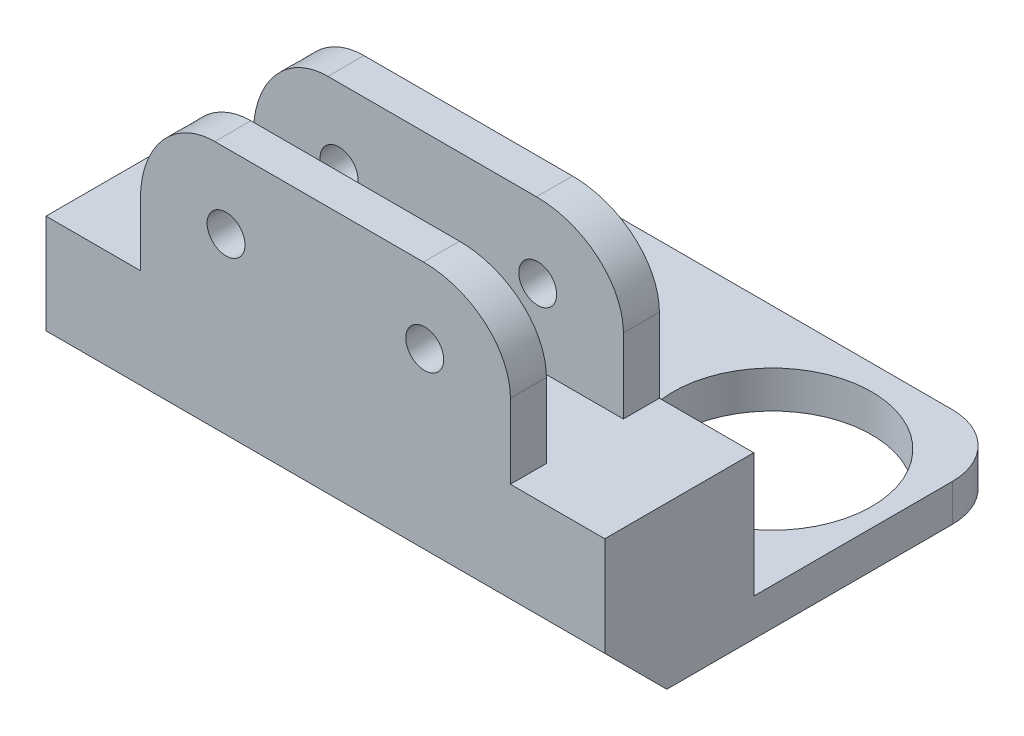
ISO-10303-21;
HEADER;
FILE_DESCRIPTION(('STEP AP214'),'2;1');
FILE_NAME('part.step','',(''),(''),'','','');
FILE_SCHEMA(('AUTOMOTIVE_DESIGN { 1 0 10303 214 1 1 1 1 }'));
ENDSEC;
DATA;
#1=APPLICATION_CONTEXT('core data for automotive mechanical design processes');
#2=APPLICATION_PROTOCOL_DEFINITION('international standard','automotive_design',2000,#1);
#3=PRODUCT_CONTEXT('',#1,'mechanical');
#4=PRODUCT('Part','Part','',(#3));
#5=PRODUCT_RELATED_PRODUCT_CATEGORY('part','',(#4));
#6=PRODUCT_DEFINITION_FORMATION('','',#4);
#7=PRODUCT_DEFINITION_CONTEXT('part definition',#1,'design');
#8=PRODUCT_DEFINITION('design','',#6,#7);
#9=PRODUCT_DEFINITION_SHAPE('','',#8);
#10=(LENGTH_UNIT() NAMED_UNIT(*) SI_UNIT(.MILLI.,.METRE.));
#11=(NAMED_UNIT(*) PLANE_ANGLE_UNIT() SI_UNIT($,.RADIAN.));
#12=(NAMED_UNIT(*) SI_UNIT($,.STERADIAN.) SOLID_ANGLE_UNIT());
#13=UNCERTAINTY_MEASURE_WITH_UNIT(LENGTH_MEASURE(1.E-05),#10,'distance_accuracy_value','');
#14=(GEOMETRIC_REPRESENTATION_CONTEXT(3) GLOBAL_UNCERTAINTY_ASSIGNED_CONTEXT((#13)) GLOBAL_UNIT_ASSIGNED_CONTEXT((#10,
#11,#12)) REPRESENTATION_CONTEXT('',''));
#15=CARTESIAN_POINT('',(0.,0.,0.));
#16=DIRECTION('',(0.,0.,1.));
#17=DIRECTION('',(1.,0.,0.));
#18=AXIS2_PLACEMENT_3D('',#15,#16,#17);
#19=CARTESIAN_POINT('',(0.,3.,23.));
#20=DIRECTION('',(0.,0.,-1.));
#21=DIRECTION('',(-1.,0.,0.));
#22=AXIS2_PLACEMENT_3D('',#19,#20,#21);
#23=PLANE('',#22);
#24=CARTESIAN_POINT('',(8.,19.,23.));
#25=DIRECTION('',(0.,0.,-1.));
#26=DIRECTION('',(-1.,0.,0.));
#27=AXIS2_PLACEMENT_3D('',#24,#25,#26);
#28=CIRCLE('',#27,1.525);
#29=CARTESIAN_POINT('',(6.475,19.,23.));
#30=VERTEX_POINT('',#29);
#31=EDGE_CURVE('E330',#30,#30,#28,.T.);
#32=ORIENTED_EDGE('',*,*,#31,.T.);
#33=EDGE_LOOP('',(#32));
#34=FACE_BOUND('',#33,.T.);
#35=CARTESIAN_POINT('',(-8.,19.,23.));
#36=DIRECTION('',(0.,0.,-1.));
#37=DIRECTION('',(-1.,0.,0.));
#38=AXIS2_PLACEMENT_3D('',#35,#36,#37);
#39=CIRCLE('',#38,1.525);
#40=CARTESIAN_POINT('',(-9.525,19.,23.));
#41=VERTEX_POINT('',#40);
#42=EDGE_CURVE('E338',#41,#41,#39,.T.);
#43=ORIENTED_EDGE('',*,*,#42,.T.);
#44=EDGE_LOOP('',(#43));
#45=FACE_BOUND('',#44,.T.);
#46=DIRECTION('',(0.,-1.,0.));
#47=VECTOR('',#46,1.);
#48=CARTESIAN_POINT('',(14.9,3.,23.));
#49=LINE('',#48,#47);
#50=CARTESIAN_POINT('',(14.9,19.,23.));
#51=VERTEX_POINT('',#50);
#52=CARTESIAN_POINT('',(14.9,13.,23.));
#53=VERTEX_POINT('',#52);
#54=EDGE_CURVE('E271',#51,#53,#49,.T.);
#55=ORIENTED_EDGE('',*,*,#54,.F.);
#56=CARTESIAN_POINT('',(7.9,25.,23.));
#57=CARTESIAN_POINT('',(14.9,25.,23.));
#58=CARTESIAN_POINT('',(14.9,19.,23.));
#59=(BOUNDED_CURVE() B_SPLINE_CURVE(2,(#56,#57,#58),.UNSPECIFIED.,.F.,
.F.) B_SPLINE_CURVE_WITH_KNOTS((3,3),(0.,1.),
.UNSPECIFIED.) CURVE() GEOMETRIC_REPRESENTATION_ITEM() RATIONAL_B_SPLINE_CURVE((1.,
0.707106781186547,1.)) REPRESENTATION_ITEM(''));
#60=CARTESIAN_POINT('',(7.9,25.,23.));
#61=VERTEX_POINT('',#60);
#62=EDGE_CURVE('E416',#51,#61,#59,.F.);
#63=ORIENTED_EDGE('',*,*,#62,.T.);
#64=DIRECTION('',(1.,0.,0.));
#65=VECTOR('',#64,1.);
#66=CARTESIAN_POINT('',(0.,25.,23.));
#67=LINE('',#66,#65);
#68=CARTESIAN_POINT('',(-8.9,25.,23.));
#69=VERTEX_POINT('',#68);
#70=EDGE_CURVE('E355',#69,#61,#67,.T.);
#71=ORIENTED_EDGE('',*,*,#70,.F.);
#72=CARTESIAN_POINT('',(-14.9,18.,23.));
#73=CARTESIAN_POINT('',(-14.9,25.,23.));
#74=CARTESIAN_POINT('',(-8.9,25.,23.));
#75=(BOUNDED_CURVE() B_SPLINE_CURVE(2,(#72,#73,#74),.UNSPECIFIED.,.F.,
.F.) B_SPLINE_CURVE_WITH_KNOTS((3,3),(0.,1.),
.UNSPECIFIED.) CURVE() GEOMETRIC_REPRESENTATION_ITEM() RATIONAL_B_SPLINE_CURVE((1.,
0.707106781186548,1.)) REPRESENTATION_ITEM(''));
#76=CARTESIAN_POINT('',(-14.9,18.,23.));
#77=VERTEX_POINT('',#76);
#78=EDGE_CURVE('E66',#69,#77,#75,.F.);
#79=ORIENTED_EDGE('',*,*,#78,.T.);
#80=DIRECTION('',(0.,-1.,0.));
#81=VECTOR('',#80,1.);
#82=CARTESIAN_POINT('',(-14.9,3.,23.));
#83=LINE('',#82,#81);
#84=CARTESIAN_POINT('',(-14.9,13.,23.));
#85=VERTEX_POINT('',#84);
#86=EDGE_CURVE('E295',#77,#85,#83,.T.);
#87=ORIENTED_EDGE('',*,*,#86,.T.);
#88=DIRECTION('',(-1.,0.,0.));
#89=VECTOR('',#88,1.);
#90=CARTESIAN_POINT('',(0.,13.,23.));
#91=LINE('',#90,#89);
#92=CARTESIAN_POINT('',(-22.5,13.,23.));
#93=VERTEX_POINT('',#92);
#94=EDGE_CURVE('E343',#85,#93,#91,.T.);
#95=ORIENTED_EDGE('',*,*,#94,.T.);
#96=DIRECTION('',(0.,-1.,0.));
#97=VECTOR('',#96,1.);
#98=CARTESIAN_POINT('',(-22.5,3.,23.));
#99=LINE('',#98,#97);
#100=CARTESIAN_POINT('',(-22.5,5.,23.));
#101=VERTEX_POINT('',#100);
#102=EDGE_CURVE('E552',#93,#101,#99,.T.);
#103=ORIENTED_EDGE('',*,*,#102,.T.);
#104=DIRECTION('',(1.,0.,0.));
#105=VECTOR('',#104,1.);
#106=CARTESIAN_POINT('',(0.,5.,23.));
#107=LINE('',#106,#105);
#108=CARTESIAN_POINT('',(22.5,5.,23.));
#109=VERTEX_POINT('',#108);
#110=EDGE_CURVE('E557',#101,#109,#107,.T.);
#111=ORIENTED_EDGE('',*,*,#110,.T.);
#112=DIRECTION('',(0.,-1.,0.));
#113=VECTOR('',#112,1.);
#114=CARTESIAN_POINT('',(22.5,3.,23.));
#115=LINE('',#114,#113);
#116=CARTESIAN_POINT('',(22.5,13.,23.));
#117=VERTEX_POINT('',#116);
#118=EDGE_CURVE('E537',#117,#109,#115,.T.);
#119=ORIENTED_EDGE('',*,*,#118,.F.);
#120=DIRECTION('',(1.,0.,0.));
#121=VECTOR('',#120,1.);
#122=CARTESIAN_POINT('',(0.,13.,23.));
#123=LINE('',#122,#121);
#124=EDGE_CURVE('E341',#53,#117,#123,.T.);
#125=ORIENTED_EDGE('',*,*,#124,.F.);
#126=EDGE_LOOP('',(#55,#63,#71,#79,#87,#95,#103,#111,#119,#125));
#127=FACE_BOUND('',#126,.T.);
#128=ADVANCED_FACE('F45',(#34,#45,#127),#23,.F.);
#129=CARTESIAN_POINT('',(22.5,3.,0.));
#130=DIRECTION('',(-1.,0.,0.));
#131=DIRECTION('',(0.,0.,1.));
#132=AXIS2_PLACEMENT_3D('',#129,#130,#131);
#133=PLANE('',#132);
#134=DIRECTION('',(0.,0.,-1.));
#135=VECTOR('',#134,1.);
#136=CARTESIAN_POINT('',(22.5,0.,0.));
#137=LINE('',#136,#135);
#138=CARTESIAN_POINT('',(22.5,0.,18.));
#139=VERTEX_POINT('',#138);
#140=CARTESIAN_POINT('',(22.5,0.,-5.));
#141=VERTEX_POINT('',#140);
#142=EDGE_CURVE('E546',#139,#141,#137,.T.);
#143=ORIENTED_EDGE('',*,*,#142,.T.);
#144=DIRECTION('',(0.,-1.,0.));
#145=VECTOR('',#144,1.);
#146=CARTESIAN_POINT('',(22.5,3.,-5.));
#147=LINE('',#146,#145);
#148=CARTESIAN_POINT('',(22.5,3.,-5.));
#149=VERTEX_POINT('',#148);
#150=EDGE_CURVE('E488',#141,#149,#147,.F.);
#151=ORIENTED_EDGE('',*,*,#150,.T.);
#152=DIRECTION('',(0.,0.,-1.));
#153=VECTOR('',#152,1.);
#154=CARTESIAN_POINT('',(22.5,3.,0.));
#155=LINE('',#154,#153);
#156=CARTESIAN_POINT('',(22.5,3.,11.));
#157=VERTEX_POINT('',#156);
#158=EDGE_CURVE('E532',#157,#149,#155,.T.);
#159=ORIENTED_EDGE('',*,*,#158,.F.);
#160=DIRECTION('',(0.,-1.,0.));
#161=VECTOR('',#160,1.);
#162=CARTESIAN_POINT('',(22.5,13.,11.));
#163=LINE('',#162,#161);
#164=CARTESIAN_POINT('',(22.5,13.,11.));
#165=VERTEX_POINT('',#164);
#166=EDGE_CURVE('E519',#165,#157,#163,.T.);
#167=ORIENTED_EDGE('',*,*,#166,.F.);
#168=DIRECTION('',(0.,0.,-1.));
#169=VECTOR('',#168,1.);
#170=CARTESIAN_POINT('',(22.5,13.,0.));
#171=LINE('',#170,#169);
#172=EDGE_CURVE('E223',#117,#165,#171,.T.);
#173=ORIENTED_EDGE('',*,*,#172,.F.);
#174=ORIENTED_EDGE('',*,*,#118,.T.);
#175=DIRECTION('',(0.,0.707106781186546,0.707106781186549));
#176=VECTOR('',#175,1.);
#177=CARTESIAN_POINT('',(22.5,5.,23.));
#178=LINE('',#177,#176);
#179=EDGE_CURVE('E564',#109,#139,#178,.F.);
#180=ORIENTED_EDGE('',*,*,#179,.T.);
#181=EDGE_LOOP('',(#143,#151,#159,#167,#173,#174,#180));
#182=FACE_BOUND('',#181,.T.);
#183=ADVANCED_FACE('F256',(#182),#133,.F.);
#184=CARTESIAN_POINT('',(0.,13.,11.));
#185=DIRECTION('',(0.,0.,-1.));
#186=DIRECTION('',(-1.,0.,0.));
#187=AXIS2_PLACEMENT_3D('',#184,#185,#186);
#188=PLANE('',#187);
#189=DIRECTION('',(1.,0.,0.));
#190=VECTOR('',#189,1.);
#191=CARTESIAN_POINT('',(0.,25.,11.));
#192=LINE('',#191,#190);
#193=CARTESIAN_POINT('',(-8.9,25.,11.));
#194=VERTEX_POINT('',#193);
#195=CARTESIAN_POINT('',(7.9,25.,11.));
#196=VERTEX_POINT('',#195);
#197=EDGE_CURVE('E505',#194,#196,#192,.T.);
#198=ORIENTED_EDGE('',*,*,#197,.T.);
#199=CARTESIAN_POINT('',(14.9,19.,11.));
#200=CARTESIAN_POINT('',(14.9,25.,11.));
#201=CARTESIAN_POINT('',(7.9,25.,11.));
#202=(BOUNDED_CURVE() B_SPLINE_CURVE(2,(#199,#200,#201),.UNSPECIFIED.,.F.,
.F.) B_SPLINE_CURVE_WITH_KNOTS((3,3),(0.,1.),
.UNSPECIFIED.) CURVE() GEOMETRIC_REPRESENTATION_ITEM() RATIONAL_B_SPLINE_CURVE((1.,
0.707106781186548,1.)) REPRESENTATION_ITEM(''));
#203=CARTESIAN_POINT('',(14.9,19.,11.));
#204=VERTEX_POINT('',#203);
#205=EDGE_CURVE('E206',#196,#204,#202,.F.);
#206=ORIENTED_EDGE('',*,*,#205,.T.);
#207=DIRECTION('',(0.,-1.,0.));
#208=VECTOR('',#207,1.);
#209=CARTESIAN_POINT('',(14.9,0.,11.));
#210=LINE('',#209,#208);
#211=CARTESIAN_POINT('',(14.9,13.,11.));
#212=VERTEX_POINT('',#211);
#213=EDGE_CURVE('E198',#204,#212,#210,.T.);
#214=ORIENTED_EDGE('',*,*,#213,.T.);
#215=DIRECTION('',(1.,0.,0.));
#216=VECTOR('',#215,1.);
#217=CARTESIAN_POINT('',(0.,13.,11.));
#218=LINE('',#217,#216);
#219=EDGE_CURVE('E204',#212,#165,#218,.T.);
#220=ORIENTED_EDGE('',*,*,#219,.T.);
#221=ORIENTED_EDGE('',*,*,#166,.T.);
#222=DIRECTION('',(1.,0.,0.));
#223=VECTOR('',#222,1.);
#224=CARTESIAN_POINT('',(0.,3.,11.));
#225=LINE('',#224,#223);
#226=CARTESIAN_POINT('',(-22.5,3.,11.));
#227=VERTEX_POINT('',#226);
#228=EDGE_CURVE('E513',#227,#157,#225,.T.);
#229=ORIENTED_EDGE('',*,*,#228,.F.);
#230=DIRECTION('',(0.,-1.,0.));
#231=VECTOR('',#230,1.);
#232=CARTESIAN_POINT('',(-22.5,13.,11.));
#233=LINE('',#232,#231);
#234=CARTESIAN_POINT('',(-22.5,13.,11.));
#235=VERTEX_POINT('',#234);
#236=EDGE_CURVE('E515',#235,#227,#233,.T.);
#237=ORIENTED_EDGE('',*,*,#236,.F.);
#238=DIRECTION('',(-1.,0.,0.));
#239=VECTOR('',#238,1.);
#240=CARTESIAN_POINT('',(0.,13.,11.));
#241=LINE('',#240,#239);
#242=CARTESIAN_POINT('',(-14.9,13.,11.));
#243=VERTEX_POINT('',#242);
#244=EDGE_CURVE('E1141',#243,#235,#241,.T.);
#245=ORIENTED_EDGE('',*,*,#244,.F.);
#246=DIRECTION('',(0.,-1.,0.));
#247=VECTOR('',#246,1.);
#248=CARTESIAN_POINT('',(-14.9,0.,11.));
#249=LINE('',#248,#247);
#250=CARTESIAN_POINT('',(-14.9,18.,11.));
#251=VERTEX_POINT('',#250);
#252=EDGE_CURVE('E236',#251,#243,#249,.T.);
#253=ORIENTED_EDGE('',*,*,#252,.F.);
#254=CARTESIAN_POINT('',(-8.9,25.,11.));
#255=CARTESIAN_POINT('',(-14.9,25.,11.));
#256=CARTESIAN_POINT('',(-14.9,18.,11.));
#257=(BOUNDED_CURVE() B_SPLINE_CURVE(2,(#254,#255,#256),.UNSPECIFIED.,.F.,
.F.) B_SPLINE_CURVE_WITH_KNOTS((3,3),(0.,1.),
.UNSPECIFIED.) CURVE() GEOMETRIC_REPRESENTATION_ITEM() RATIONAL_B_SPLINE_CURVE((1.,
0.707106781186548,1.)) REPRESENTATION_ITEM(''));
#258=EDGE_CURVE('E240',#251,#194,#257,.F.);
#259=ORIENTED_EDGE('',*,*,#258,.T.);
#260=EDGE_LOOP('',(#198,#206,#214,#220,#221,#229,#237,#245,#253,#259));
#261=FACE_BOUND('',#260,.T.);
#262=CARTESIAN_POINT('',(-8.,19.,11.));
#263=DIRECTION('',(0.,0.,-1.));
#264=DIRECTION('',(-1.,0.,0.));
#265=AXIS2_PLACEMENT_3D('',#262,#263,#264);
#266=CIRCLE('',#265,1.525);
#267=CARTESIAN_POINT('',(-9.525,19.,11.));
#268=VERTEX_POINT('',#267);
#269=EDGE_CURVE('E231',#268,#268,#266,.T.);
#270=ORIENTED_EDGE('',*,*,#269,.F.);
#271=EDGE_LOOP('',(#270));
#272=FACE_BOUND('',#271,.T.);
#273=CARTESIAN_POINT('',(8.,19.,11.));
#274=DIRECTION('',(0.,0.,-1.));
#275=DIRECTION('',(-1.,0.,0.));
#276=AXIS2_PLACEMENT_3D('',#273,#274,#275);
#277=CIRCLE('',#276,1.525);
#278=CARTESIAN_POINT('',(6.475,19.,11.));
#279=VERTEX_POINT('',#278);
#280=EDGE_CURVE('E392',#279,#279,#277,.T.);
#281=ORIENTED_EDGE('',*,*,#280,.F.);
#282=EDGE_LOOP('',(#281));
#283=FACE_BOUND('',#282,.T.);
#284=ADVANCED_FACE('F201',(#261,#272,#283),#188,.T.);
#285=CARTESIAN_POINT('',(0.,25.,13.9));
#286=DIRECTION('',(0.,0.,-1.));
#287=DIRECTION('',(-1.,0.,0.));
#288=AXIS2_PLACEMENT_3D('',#285,#286,#287);
#289=PLANE('',#288);
#290=CARTESIAN_POINT('',(8.,19.,13.9));
#291=DIRECTION('',(0.,0.,-1.));
#292=DIRECTION('',(-1.,0.,0.));
#293=AXIS2_PLACEMENT_3D('',#290,#291,#292);
#294=CIRCLE('',#293,1.525);
#295=CARTESIAN_POINT('',(6.475,19.,13.9));
#296=VERTEX_POINT('',#295);
#297=EDGE_CURVE('E327',#296,#296,#294,.T.);
#298=ORIENTED_EDGE('',*,*,#297,.T.);
#299=EDGE_LOOP('',(#298));
#300=FACE_BOUND('',#299,.T.);
#301=CARTESIAN_POINT('',(-8.,19.,13.9));
#302=DIRECTION('',(0.,0.,-1.));
#303=DIRECTION('',(-1.,0.,0.));
#304=AXIS2_PLACEMENT_3D('',#301,#302,#303);
#305=CIRCLE('',#304,1.525);
#306=CARTESIAN_POINT('',(-9.525,19.,13.9));
#307=VERTEX_POINT('',#306);
#308=EDGE_CURVE('E335',#307,#307,#305,.T.);
#309=ORIENTED_EDGE('',*,*,#308,.T.);
#310=EDGE_LOOP('',(#309));
#311=FACE_BOUND('',#310,.T.);
#312=DIRECTION('',(0.,-1.,0.));
#313=VECTOR('',#312,1.);
#314=CARTESIAN_POINT('',(14.9,25.,13.9));
#315=LINE('',#314,#313);
#316=CARTESIAN_POINT('',(14.9,19.,13.9));
#317=VERTEX_POINT('',#316);
#318=CARTESIAN_POINT('',(14.9,13.,13.9));
#319=VERTEX_POINT('',#318);
#320=EDGE_CURVE('E215',#317,#319,#315,.T.);
#321=ORIENTED_EDGE('',*,*,#320,.F.);
#322=CARTESIAN_POINT('',(7.9,25.,13.9));
#323=CARTESIAN_POINT('',(14.9,25.,13.9));
#324=CARTESIAN_POINT('',(14.9,19.,13.9));
#325=(BOUNDED_CURVE() B_SPLINE_CURVE(2,(#322,#323,#324),.UNSPECIFIED.,.F.,
.F.) B_SPLINE_CURVE_WITH_KNOTS((3,3),(0.,1.),
.UNSPECIFIED.) CURVE() GEOMETRIC_REPRESENTATION_ITEM() RATIONAL_B_SPLINE_CURVE((1.,
0.707106781186547,1.)) REPRESENTATION_ITEM(''));
#326=CARTESIAN_POINT('',(7.9,25.,13.9));
#327=VERTEX_POINT('',#326);
#328=EDGE_CURVE('E472',#317,#327,#325,.F.);
#329=ORIENTED_EDGE('',*,*,#328,.T.);
#330=DIRECTION('',(1.,0.,0.));
#331=VECTOR('',#330,1.);
#332=CARTESIAN_POINT('',(0.,25.,13.9));
#333=LINE('',#332,#331);
#334=CARTESIAN_POINT('',(-8.9,25.,13.9));
#335=VERTEX_POINT('',#334);
#336=EDGE_CURVE('E502',#335,#327,#333,.T.);
#337=ORIENTED_EDGE('',*,*,#336,.F.);
#338=CARTESIAN_POINT('',(-14.9,18.,13.9));
#339=CARTESIAN_POINT('',(-14.9,25.,13.9));
#340=CARTESIAN_POINT('',(-8.9,25.,13.9));
#341=(BOUNDED_CURVE() B_SPLINE_CURVE(2,(#338,#339,#340),.UNSPECIFIED.,.F.,
.F.) B_SPLINE_CURVE_WITH_KNOTS((3,3),(0.,1.),
.UNSPECIFIED.) CURVE() GEOMETRIC_REPRESENTATION_ITEM() RATIONAL_B_SPLINE_CURVE((1.,
0.707106781186548,1.)) REPRESENTATION_ITEM(''));
#342=CARTESIAN_POINT('',(-14.9,18.,13.9));
#343=VERTEX_POINT('',#342);
#344=EDGE_CURVE('E473',#335,#343,#341,.F.);
#345=ORIENTED_EDGE('',*,*,#344,.T.);
#346=DIRECTION('',(0.,-1.,0.));
#347=VECTOR('',#346,1.);
#348=CARTESIAN_POINT('',(-14.9,25.,13.9));
#349=LINE('',#348,#347);
#350=CARTESIAN_POINT('',(-14.9,13.,13.9));
#351=VERTEX_POINT('',#350);
#352=EDGE_CURVE('E316',#343,#351,#349,.T.);
#353=ORIENTED_EDGE('',*,*,#352,.T.);
#354=DIRECTION('',(-1.,0.,0.));
#355=VECTOR('',#354,1.);
#356=CARTESIAN_POINT('',(0.,13.,13.9));
#357=LINE('',#356,#355);
#358=EDGE_CURVE('E555',#319,#351,#357,.T.);
#359=ORIENTED_EDGE('',*,*,#358,.F.);
#360=EDGE_LOOP('',(#321,#329,#337,#345,#353,#359));
#361=FACE_BOUND('',#360,.T.);
#362=ADVANCED_FACE('F255',(#300,#311,#361),#289,.F.);
#363=CARTESIAN_POINT('',(0.,25.,0.));
#364=DIRECTION('',(0.,1.,0.));
#365=DIRECTION('',(0.,0.,1.));
#366=AXIS2_PLACEMENT_3D('',#363,#364,#365);
#367=PLANE('',#366);
#368=ORIENTED_EDGE('',*,*,#336,.T.);
#369=CARTESIAN_POINT('',(7.9,25.,10.855));
#370=CARTESIAN_POINT('',(7.9,25.,11.9183333333333));
#371=CARTESIAN_POINT('',(7.9,25.,12.9816666666667));
#372=CARTESIAN_POINT('',(7.9,25.,14.045));
#373=(BOUNDED_CURVE() B_SPLINE_CURVE(3,(#369,#370,#371,#372),.UNSPECIFIED.,.F.,
.F.) B_SPLINE_CURVE_WITH_KNOTS((4,4),(-0.014045,-0.010855),
.UNSPECIFIED.) CURVE() GEOMETRIC_REPRESENTATION_ITEM() RATIONAL_B_SPLINE_CURVE((1.,1.,1.,1.)) REPRESENTATION_ITEM(''));
#374=EDGE_CURVE('E482',#327,#196,#373,.F.);
#375=ORIENTED_EDGE('',*,*,#374,.T.);
#376=ORIENTED_EDGE('',*,*,#197,.F.);
#377=CARTESIAN_POINT('',(-8.9,25.,14.045));
#378=CARTESIAN_POINT('',(-8.9,25.,12.9816666666667));
#379=CARTESIAN_POINT('',(-8.9,25.,11.9183333333333));
#380=CARTESIAN_POINT('',(-8.9,25.,10.855));
#381=(BOUNDED_CURVE() B_SPLINE_CURVE(3,(#377,#378,#379,#380),.UNSPECIFIED.,.F.,
.F.) B_SPLINE_CURVE_WITH_KNOTS((4,4),(-0.016645,-0.013455),
.UNSPECIFIED.) CURVE() GEOMETRIC_REPRESENTATION_ITEM() RATIONAL_B_SPLINE_CURVE((1.,1.,1.,1.)) REPRESENTATION_ITEM(''));
#382=EDGE_CURVE('E484',#194,#335,#381,.F.);
#383=ORIENTED_EDGE('',*,*,#382,.T.);
#384=EDGE_LOOP('',(#368,#375,#376,#383));
#385=FACE_BOUND('',#384,.T.);
#386=ADVANCED_FACE('F755',(#385),#367,.T.);
#387=CARTESIAN_POINT('',(0.,25.,20.1));
#388=DIRECTION('',(0.,0.,-1.));
#389=DIRECTION('',(-1.,0.,0.));
#390=AXIS2_PLACEMENT_3D('',#387,#388,#389);
#391=PLANE('',#390);
#392=DIRECTION('',(1.,0.,0.));
#393=VECTOR('',#392,1.);
#394=CARTESIAN_POINT('',(0.,25.,20.1));
#395=LINE('',#394,#393);
#396=CARTESIAN_POINT('',(-8.9,25.,20.1));
#397=VERTEX_POINT('',#396);
#398=CARTESIAN_POINT('',(7.9,25.,20.1));
#399=VERTEX_POINT('',#398);
#400=EDGE_CURVE('E346',#397,#399,#395,.T.);
#401=ORIENTED_EDGE('',*,*,#400,.T.);
#402=CARTESIAN_POINT('',(14.9,19.,20.1));
#403=CARTESIAN_POINT('',(14.9,25.,20.1));
#404=CARTESIAN_POINT('',(7.9,25.,20.1));
#405=(BOUNDED_CURVE() B_SPLINE_CURVE(2,(#402,#403,#404),.UNSPECIFIED.,.F.,
.F.) B_SPLINE_CURVE_WITH_KNOTS((3,3),(0.,1.),
.UNSPECIFIED.) CURVE() GEOMETRIC_REPRESENTATION_ITEM() RATIONAL_B_SPLINE_CURVE((1.,
0.707106781186548,1.)) REPRESENTATION_ITEM(''));
#406=CARTESIAN_POINT('',(14.9,19.,20.1));
#407=VERTEX_POINT('',#406);
#408=EDGE_CURVE('E404',#399,#407,#405,.F.);
#409=ORIENTED_EDGE('',*,*,#408,.T.);
#410=DIRECTION('',(0.,-1.,0.));
#411=VECTOR('',#410,1.);
#412=CARTESIAN_POINT('',(14.9,25.,20.1));
#413=LINE('',#412,#411);
#414=CARTESIAN_POINT('',(14.9,13.,20.1));
#415=VERTEX_POINT('',#414);
#416=EDGE_CURVE('E272',#407,#415,#413,.T.);
#417=ORIENTED_EDGE('',*,*,#416,.T.);
#418=DIRECTION('',(-1.,0.,0.));
#419=VECTOR('',#418,1.);
#420=CARTESIAN_POINT('',(0.,13.,20.1));
#421=LINE('',#420,#419);
#422=CARTESIAN_POINT('',(-14.9,13.,20.1));
#423=VERTEX_POINT('',#422);
#424=EDGE_CURVE('E506',#415,#423,#421,.T.);
#425=ORIENTED_EDGE('',*,*,#424,.T.);
#426=DIRECTION('',(0.,-1.,0.));
#427=VECTOR('',#426,1.);
#428=CARTESIAN_POINT('',(-14.9,25.,20.1));
#429=LINE('',#428,#427);
#430=CARTESIAN_POINT('',(-14.9,18.,20.1));
#431=VERTEX_POINT('',#430);
#432=EDGE_CURVE('E285',#431,#423,#429,.T.);
#433=ORIENTED_EDGE('',*,*,#432,.F.);
#434=CARTESIAN_POINT('',(-8.9,25.,20.1));
#435=CARTESIAN_POINT('',(-14.9,25.,20.1));
#436=CARTESIAN_POINT('',(-14.9,18.,20.1));
#437=(BOUNDED_CURVE() B_SPLINE_CURVE(2,(#434,#435,#436),.UNSPECIFIED.,.F.,
.F.) B_SPLINE_CURVE_WITH_KNOTS((3,3),(0.,1.),
.UNSPECIFIED.) CURVE() GEOMETRIC_REPRESENTATION_ITEM() RATIONAL_B_SPLINE_CURVE((1.,
0.707106781186548,1.)) REPRESENTATION_ITEM(''));
#438=EDGE_CURVE('E396',#431,#397,#437,.F.);
#439=ORIENTED_EDGE('',*,*,#438,.T.);
#440=EDGE_LOOP('',(#401,#409,#417,#425,#433,#439));
#441=FACE_BOUND('',#440,.T.);
#442=CARTESIAN_POINT('',(-8.,19.,20.1));
#443=DIRECTION('',(0.,0.,-1.));
#444=DIRECTION('',(-1.,0.,0.));
#445=AXIS2_PLACEMENT_3D('',#442,#443,#444);
#446=CIRCLE('',#445,1.525);
#447=CARTESIAN_POINT('',(-9.525,19.,20.1));
#448=VERTEX_POINT('',#447);
#449=EDGE_CURVE('E334',#448,#448,#446,.T.);
#450=ORIENTED_EDGE('',*,*,#449,.F.);
#451=EDGE_LOOP('',(#450));
#452=FACE_BOUND('',#451,.T.);
#453=CARTESIAN_POINT('',(8.,19.,20.1));
#454=DIRECTION('',(0.,0.,-1.));
#455=DIRECTION('',(-1.,0.,0.));
#456=AXIS2_PLACEMENT_3D('',#453,#454,#455);
#457=CIRCLE('',#456,1.525);
#458=CARTESIAN_POINT('',(6.475,19.,20.1));
#459=VERTEX_POINT('',#458);
#460=EDGE_CURVE('E331',#459,#459,#457,.T.);
#461=ORIENTED_EDGE('',*,*,#460,.F.);
#462=EDGE_LOOP('',(#461));
#463=FACE_BOUND('',#462,.T.);
#464=ADVANCED_FACE('F377',(#441,#452,#463),#391,.T.);
#465=CARTESIAN_POINT('',(0.,25.,0.));
#466=DIRECTION('',(0.,1.,0.));
#467=DIRECTION('',(0.,0.,1.));
#468=AXIS2_PLACEMENT_3D('',#465,#466,#467);
#469=PLANE('',#468);
#470=ORIENTED_EDGE('',*,*,#70,.T.);
#471=CARTESIAN_POINT('',(7.9,25.,19.955));
#472=CARTESIAN_POINT('',(7.9,25.,21.0183333333334));
#473=CARTESIAN_POINT('',(7.9,25.,22.0816666666666));
#474=CARTESIAN_POINT('',(7.9,25.,23.145));
#475=(BOUNDED_CURVE() B_SPLINE_CURVE(3,(#471,#472,#473,#474),.UNSPECIFIED.,.F.,
.F.) B_SPLINE_CURVE_WITH_KNOTS((4,4),(-0.023145,-0.019955),
.UNSPECIFIED.) CURVE() GEOMETRIC_REPRESENTATION_ITEM() RATIONAL_B_SPLINE_CURVE((1.,1.,1.,1.)) REPRESENTATION_ITEM(''));
#476=EDGE_CURVE('E471',#61,#399,#475,.F.);
#477=ORIENTED_EDGE('',*,*,#476,.T.);
#478=ORIENTED_EDGE('',*,*,#400,.F.);
#479=CARTESIAN_POINT('',(-8.9,25.,23.145));
#480=CARTESIAN_POINT('',(-8.9,25.,22.0816666666667));
#481=CARTESIAN_POINT('',(-8.9,25.,21.0183333333333));
#482=CARTESIAN_POINT('',(-8.9,25.,19.955));
#483=(BOUNDED_CURVE() B_SPLINE_CURVE(3,(#479,#480,#481,#482),.UNSPECIFIED.,.F.,
.F.) B_SPLINE_CURVE_WITH_KNOTS((4,4),(-0.007545,-0.004355),
.UNSPECIFIED.) CURVE() GEOMETRIC_REPRESENTATION_ITEM() RATIONAL_B_SPLINE_CURVE((1.,1.,1.,1.)) REPRESENTATION_ITEM(''));
#484=EDGE_CURVE('E362',#397,#69,#483,.F.);
#485=ORIENTED_EDGE('',*,*,#484,.T.);
#486=EDGE_LOOP('',(#470,#477,#478,#485));
#487=FACE_BOUND('',#486,.T.);
#488=ADVANCED_FACE('F369',(#487),#469,.T.);
#489=CARTESIAN_POINT('',(0.,13.,0.));
#490=DIRECTION('',(0.,1.,0.));
#491=DIRECTION('',(0.,0.,1.));
#492=AXIS2_PLACEMENT_3D('',#489,#490,#491);
#493=PLANE('',#492);
#494=DIRECTION('',(0.,0.,-1.));
#495=VECTOR('',#494,1.);
#496=CARTESIAN_POINT('',(14.9,13.,27.5));
#497=LINE('',#496,#495);
#498=EDGE_CURVE('E210',#319,#212,#497,.T.);
#499=ORIENTED_EDGE('',*,*,#498,.F.);
#500=ORIENTED_EDGE('',*,*,#358,.T.);
#501=DIRECTION('',(0.,0.,-1.));
#502=VECTOR('',#501,1.);
#503=CARTESIAN_POINT('',(-14.9,13.,27.5));
#504=LINE('',#503,#502);
#505=EDGE_CURVE('E227',#351,#243,#504,.T.);
#506=ORIENTED_EDGE('',*,*,#505,.T.);
#507=ORIENTED_EDGE('',*,*,#244,.T.);
#508=DIRECTION('',(0.,0.,1.));
#509=VECTOR('',#508,1.);
#510=CARTESIAN_POINT('',(-22.5,13.,0.));
#511=LINE('',#510,#509);
#512=EDGE_CURVE('E512',#235,#93,#511,.T.);
#513=ORIENTED_EDGE('',*,*,#512,.T.);
#514=ORIENTED_EDGE('',*,*,#94,.F.);
#515=EDGE_CURVE('E224',#85,#423,#504,.T.);
#516=ORIENTED_EDGE('',*,*,#515,.T.);
#517=ORIENTED_EDGE('',*,*,#424,.F.);
#518=EDGE_CURVE('E219',#53,#415,#497,.T.);
#519=ORIENTED_EDGE('',*,*,#518,.F.);
#520=ORIENTED_EDGE('',*,*,#124,.T.);
#521=ORIENTED_EDGE('',*,*,#172,.T.);
#522=ORIENTED_EDGE('',*,*,#219,.F.);
#523=EDGE_LOOP('',(#499,#500,#506,#507,#513,#514,#516,#517,#519,#520,#521,#522));
#524=FACE_BOUND('',#523,.T.);
#525=ADVANCED_FACE('F221',(#524),#493,.T.);
#526=CARTESIAN_POINT('',(0.,3.,0.));
#527=DIRECTION('',(0.,1.,0.));
#528=DIRECTION('',(0.,0.,1.));
#529=AXIS2_PLACEMENT_3D('',#526,#527,#528);
#530=PLANE('',#529);
#531=CARTESIAN_POINT('',(13.,3.,0.));
#532=DIRECTION('',(0.,1.,0.));
#533=DIRECTION('',(0.,0.,1.));
#534=AXIS2_PLACEMENT_3D('',#531,#532,#533);
#535=CIRCLE('',#534,8.);
#536=CARTESIAN_POINT('',(13.,3.,8.));
#537=VERTEX_POINT('',#536);
#538=EDGE_CURVE('E522',#537,#537,#535,.T.);
#539=ORIENTED_EDGE('',*,*,#538,.F.);
#540=EDGE_LOOP('',(#539));
#541=FACE_BOUND('',#540,.T.);
#542=CARTESIAN_POINT('',(-13.,3.,0.));
#543=DIRECTION('',(0.,1.,0.));
#544=DIRECTION('',(0.,0.,1.));
#545=AXIS2_PLACEMENT_3D('',#542,#543,#544);
#546=CIRCLE('',#545,8.);
#547=CARTESIAN_POINT('',(-13.,3.,8.));
#548=VERTEX_POINT('',#547);
#549=EDGE_CURVE('E525',#548,#548,#546,.T.);
#550=ORIENTED_EDGE('',*,*,#549,.F.);
#551=EDGE_LOOP('',(#550));
#552=FACE_BOUND('',#551,.T.);
#553=DIRECTION('',(1.,0.,0.));
#554=VECTOR('',#553,1.);
#555=CARTESIAN_POINT('',(0.,3.,-10.));
#556=LINE('',#555,#554);
#557=CARTESIAN_POINT('',(-17.5,3.,-10.));
#558=VERTEX_POINT('',#557);
#559=CARTESIAN_POINT('',(17.5,3.,-10.));
#560=VERTEX_POINT('',#559);
#561=EDGE_CURVE('E534',#558,#560,#556,.T.);
#562=ORIENTED_EDGE('',*,*,#561,.F.);
#563=CARTESIAN_POINT('',(-17.5,3.,-5.));
#564=DIRECTION('',(0.,1.,0.));
#565=DIRECTION('',(0.,0.,1.));
#566=AXIS2_PLACEMENT_3D('',#563,#564,#565);
#567=CIRCLE('',#566,5.);
#568=CARTESIAN_POINT('',(-22.5,3.,-5.));
#569=VERTEX_POINT('',#568);
#570=EDGE_CURVE('E491',#558,#569,#567,.T.);
#571=ORIENTED_EDGE('',*,*,#570,.T.);
#572=DIRECTION('',(0.,0.,-1.));
#573=VECTOR('',#572,1.);
#574=CARTESIAN_POINT('',(-22.5,3.,0.));
#575=LINE('',#574,#573);
#576=EDGE_CURVE('E529',#227,#569,#575,.T.);
#577=ORIENTED_EDGE('',*,*,#576,.F.);
#578=ORIENTED_EDGE('',*,*,#228,.T.);
#579=ORIENTED_EDGE('',*,*,#158,.T.);
#580=CARTESIAN_POINT('',(17.5,3.,-5.));
#581=DIRECTION('',(0.,1.,0.));
#582=DIRECTION('',(0.,0.,1.));
#583=AXIS2_PLACEMENT_3D('',#580,#581,#582);
#584=CIRCLE('',#583,5.);
#585=EDGE_CURVE('E498',#149,#560,#584,.T.);
#586=ORIENTED_EDGE('',*,*,#585,.T.);
#587=EDGE_LOOP('',(#562,#571,#577,#578,#579,#586));
#588=FACE_BOUND('',#587,.T.);
#589=ADVANCED_FACE('F258',(#541,#552,#588),#530,.T.);
#590=CARTESIAN_POINT('',(-22.5,3.,0.));
#591=DIRECTION('',(-1.,0.,0.));
#592=DIRECTION('',(0.,0.,1.));
#593=AXIS2_PLACEMENT_3D('',#590,#591,#592);
#594=PLANE('',#593);
#595=ORIENTED_EDGE('',*,*,#576,.T.);
#596=DIRECTION('',(0.,-1.,0.));
#597=VECTOR('',#596,1.);
#598=CARTESIAN_POINT('',(-22.5,3.,-5.));
#599=LINE('',#598,#597);
#600=CARTESIAN_POINT('',(-22.5,0.,-5.));
#601=VERTEX_POINT('',#600);
#602=EDGE_CURVE('E570',#569,#601,#599,.T.);
#603=ORIENTED_EDGE('',*,*,#602,.T.);
#604=DIRECTION('',(0.,0.,-1.));
#605=VECTOR('',#604,1.);
#606=CARTESIAN_POINT('',(-22.5,0.,0.));
#607=LINE('',#606,#605);
#608=CARTESIAN_POINT('',(-22.5,0.,18.));
#609=VERTEX_POINT('',#608);
#610=EDGE_CURVE('E543',#609,#601,#607,.T.);
#611=ORIENTED_EDGE('',*,*,#610,.F.);
#612=DIRECTION('',(0.,-0.707106781186546,-0.707106781186549));
#613=VECTOR('',#612,1.);
#614=CARTESIAN_POINT('',(-22.5,-7.5,10.5));
#615=LINE('',#614,#613);
#616=EDGE_CURVE('E568',#609,#101,#615,.F.);
#617=ORIENTED_EDGE('',*,*,#616,.T.);
#618=ORIENTED_EDGE('',*,*,#102,.F.);
#619=ORIENTED_EDGE('',*,*,#512,.F.);
#620=ORIENTED_EDGE('',*,*,#236,.T.);
#621=EDGE_LOOP('',(#595,#603,#611,#617,#618,#619,#620));
#622=FACE_BOUND('',#621,.T.);
#623=ADVANCED_FACE('F604',(#622),#594,.T.);
#624=CARTESIAN_POINT('',(-13.,3.,0.));
#625=DIRECTION('',(0.,-1.,0.));
#626=DIRECTION('',(0.,0.,-1.));
#627=AXIS2_PLACEMENT_3D('',#624,#625,#626);
#628=CYLINDRICAL_SURFACE('',#627,8.);
#629=ORIENTED_EDGE('',*,*,#549,.T.);
#630=EDGE_LOOP('',(#629));
#631=FACE_BOUND('',#630,.T.);
#632=CARTESIAN_POINT('',(-13.,0.,0.));
#633=DIRECTION('',(0.,1.,0.));
#634=DIRECTION('',(0.,0.,1.));
#635=AXIS2_PLACEMENT_3D('',#632,#633,#634);
#636=CIRCLE('',#635,8.);
#637=CARTESIAN_POINT('',(-13.,0.,8.));
#638=VERTEX_POINT('',#637);
#639=EDGE_CURVE('E540',#638,#638,#636,.T.);
#640=ORIENTED_EDGE('',*,*,#639,.F.);
#641=EDGE_LOOP('',(#640));
#642=FACE_BOUND('',#641,.T.);
#643=ADVANCED_FACE('F707',(#631,#642),#628,.F.);
#644=CARTESIAN_POINT('',(13.,3.,0.));
#645=DIRECTION('',(0.,-1.,0.));
#646=DIRECTION('',(0.,0.,-1.));
#647=AXIS2_PLACEMENT_3D('',#644,#645,#646);
#648=CYLINDRICAL_SURFACE('',#647,8.);
#649=ORIENTED_EDGE('',*,*,#538,.T.);
#650=EDGE_LOOP('',(#649));
#651=FACE_BOUND('',#650,.T.);
#652=CARTESIAN_POINT('',(13.,0.,0.));
#653=DIRECTION('',(0.,1.,0.));
#654=DIRECTION('',(0.,0.,1.));
#655=AXIS2_PLACEMENT_3D('',#652,#653,#654);
#656=CIRCLE('',#655,8.);
#657=CARTESIAN_POINT('',(13.,0.,8.));
#658=VERTEX_POINT('',#657);
#659=EDGE_CURVE('E521',#658,#658,#656,.T.);
#660=ORIENTED_EDGE('',*,*,#659,.F.);
#661=EDGE_LOOP('',(#660));
#662=FACE_BOUND('',#661,.T.);
#663=ADVANCED_FACE('F710',(#651,#662),#648,.F.);
#664=CARTESIAN_POINT('',(0.,3.,-10.));
#665=DIRECTION('',(0.,0.,-1.));
#666=DIRECTION('',(-1.,0.,0.));
#667=AXIS2_PLACEMENT_3D('',#664,#665,#666);
#668=PLANE('',#667);
#669=DIRECTION('',(1.,0.,0.));
#670=VECTOR('',#669,1.);
#671=CARTESIAN_POINT('',(0.,0.,-10.));
#672=LINE('',#671,#670);
#673=CARTESIAN_POINT('',(-17.5,0.,-10.));
#674=VERTEX_POINT('',#673);
#675=CARTESIAN_POINT('',(17.5,0.,-10.));
#676=VERTEX_POINT('',#675);
#677=EDGE_CURVE('E526',#674,#676,#672,.T.);
#678=ORIENTED_EDGE('',*,*,#677,.F.);
#679=DIRECTION('',(0.,-1.,0.));
#680=VECTOR('',#679,1.);
#681=CARTESIAN_POINT('',(-17.5,3.,-10.));
#682=LINE('',#681,#680);
#683=EDGE_CURVE('E580',#674,#558,#682,.F.);
#684=ORIENTED_EDGE('',*,*,#683,.T.);
#685=ORIENTED_EDGE('',*,*,#561,.T.);
#686=DIRECTION('',(0.,-1.,0.));
#687=VECTOR('',#686,1.);
#688=CARTESIAN_POINT('',(17.5,0.,-10.));
#689=LINE('',#688,#687);
#690=EDGE_CURVE('E577',#560,#676,#689,.T.);
#691=ORIENTED_EDGE('',*,*,#690,.T.);
#692=EDGE_LOOP('',(#678,#684,#685,#691));
#693=FACE_BOUND('',#692,.T.);
#694=ADVANCED_FACE('F589',(#693),#668,.T.);
#695=CARTESIAN_POINT('',(0.,0.,0.));
#696=DIRECTION('',(0.,1.,0.));
#697=DIRECTION('',(0.,0.,1.));
#698=AXIS2_PLACEMENT_3D('',#695,#696,#697);
#699=PLANE('',#698);
#700=ORIENTED_EDGE('',*,*,#659,.T.);
#701=EDGE_LOOP('',(#700));
#702=FACE_BOUND('',#701,.T.);
#703=ORIENTED_EDGE('',*,*,#639,.T.);
#704=EDGE_LOOP('',(#703));
#705=FACE_BOUND('',#704,.T.);
#706=ORIENTED_EDGE('',*,*,#610,.T.);
#707=CARTESIAN_POINT('',(-17.5,0.,-5.));
#708=DIRECTION('',(0.,1.,0.));
#709=DIRECTION('',(0.,0.,1.));
#710=AXIS2_PLACEMENT_3D('',#707,#708,#709);
#711=CIRCLE('',#710,5.);
#712=EDGE_CURVE('E575',#601,#674,#711,.F.);
#713=ORIENTED_EDGE('',*,*,#712,.T.);
#714=ORIENTED_EDGE('',*,*,#677,.T.);
#715=CARTESIAN_POINT('',(17.5,0.,-5.));
#716=DIRECTION('',(0.,1.,0.));
#717=DIRECTION('',(0.,0.,1.));
#718=AXIS2_PLACEMENT_3D('',#715,#716,#717);
#719=CIRCLE('',#718,5.);
#720=EDGE_CURVE('E573',#676,#141,#719,.F.);
#721=ORIENTED_EDGE('',*,*,#720,.T.);
#722=ORIENTED_EDGE('',*,*,#142,.F.);
#723=DIRECTION('',(-1.,0.,0.));
#724=VECTOR('',#723,1.);
#725=CARTESIAN_POINT('',(0.,0.,18.));
#726=LINE('',#725,#724);
#727=EDGE_CURVE('E566',#139,#609,#726,.T.);
#728=ORIENTED_EDGE('',*,*,#727,.T.);
#729=EDGE_LOOP('',(#706,#713,#714,#721,#722,#728));
#730=FACE_BOUND('',#729,.T.);
#731=ADVANCED_FACE('F308',(#702,#705,#730),#699,.F.);
#732=CARTESIAN_POINT('',(14.9,0.,27.5));
#733=DIRECTION('',(1.,0.,0.));
#734=DIRECTION('',(0.,1.,0.));
#735=AXIS2_PLACEMENT_3D('',#732,#733,#734);
#736=PLANE('',#735);
#737=ORIENTED_EDGE('',*,*,#416,.F.);
#738=CARTESIAN_POINT('',(14.9,19.,23.145));
#739=CARTESIAN_POINT('',(14.9,19.,22.0816666666666));
#740=CARTESIAN_POINT('',(14.9,19.,21.0183333333334));
#741=CARTESIAN_POINT('',(14.9,19.,19.955));
#742=(BOUNDED_CURVE() B_SPLINE_CURVE(3,(#738,#739,#740,#741),.UNSPECIFIED.,.F.,
.F.) B_SPLINE_CURVE_WITH_KNOTS((4,4),(-0.023145,-0.019955),
.UNSPECIFIED.) CURVE() GEOMETRIC_REPRESENTATION_ITEM() RATIONAL_B_SPLINE_CURVE((1.,1.,1.,1.)) REPRESENTATION_ITEM(''));
#743=EDGE_CURVE('E75',#407,#51,#742,.F.);
#744=ORIENTED_EDGE('',*,*,#743,.T.);
#745=ORIENTED_EDGE('',*,*,#54,.T.);
#746=ORIENTED_EDGE('',*,*,#518,.T.);
#747=EDGE_LOOP('',(#737,#744,#745,#746));
#748=FACE_BOUND('',#747,.T.);
#749=ADVANCED_FACE('F297',(#748),#736,.T.);
#750=CARTESIAN_POINT('',(-14.9,0.,27.5));
#751=DIRECTION('',(1.,0.,0.));
#752=DIRECTION('',(0.,1.,0.));
#753=AXIS2_PLACEMENT_3D('',#750,#751,#752);
#754=PLANE('',#753);
#755=ORIENTED_EDGE('',*,*,#86,.F.);
#756=CARTESIAN_POINT('',(-14.9,18.,19.955));
#757=CARTESIAN_POINT('',(-14.9,18.,21.0183333333333));
#758=CARTESIAN_POINT('',(-14.9,18.,22.0816666666667));
#759=CARTESIAN_POINT('',(-14.9,18.,23.145));
#760=(BOUNDED_CURVE() B_SPLINE_CURVE(3,(#756,#757,#758,#759),.UNSPECIFIED.,.F.,
.F.) B_SPLINE_CURVE_WITH_KNOTS((4,4),(-0.007545,-0.004355),
.UNSPECIFIED.) CURVE() GEOMETRIC_REPRESENTATION_ITEM() RATIONAL_B_SPLINE_CURVE((1.,1.,1.,1.)) REPRESENTATION_ITEM(''));
#761=EDGE_CURVE('E59',#77,#431,#760,.F.);
#762=ORIENTED_EDGE('',*,*,#761,.T.);
#763=ORIENTED_EDGE('',*,*,#432,.T.);
#764=ORIENTED_EDGE('',*,*,#515,.F.);
#765=EDGE_LOOP('',(#755,#762,#763,#764));
#766=FACE_BOUND('',#765,.T.);
#767=ADVANCED_FACE('F307',(#766),#754,.F.);
#768=CARTESIAN_POINT('',(8.,19.,27.5));
#769=DIRECTION('',(0.,0.,-1.));
#770=DIRECTION('',(-1.,0.,0.));
#771=AXIS2_PLACEMENT_3D('',#768,#769,#770);
#772=CYLINDRICAL_SURFACE('',#771,1.525);
#773=ORIENTED_EDGE('',*,*,#460,.T.);
#774=EDGE_LOOP('',(#773));
#775=FACE_BOUND('',#774,.T.);
#776=ORIENTED_EDGE('',*,*,#31,.F.);
#777=EDGE_LOOP('',(#776));
#778=FACE_BOUND('',#777,.T.);
#779=ADVANCED_FACE('F378',(#775,#778),#772,.F.);
#780=CARTESIAN_POINT('',(-8.,19.,27.5));
#781=DIRECTION('',(0.,0.,-1.));
#782=DIRECTION('',(-1.,0.,0.));
#783=AXIS2_PLACEMENT_3D('',#780,#781,#782);
#784=CYLINDRICAL_SURFACE('',#783,1.525);
#785=ORIENTED_EDGE('',*,*,#449,.T.);
#786=EDGE_LOOP('',(#785));
#787=FACE_BOUND('',#786,.T.);
#788=ORIENTED_EDGE('',*,*,#42,.F.);
#789=EDGE_LOOP('',(#788));
#790=FACE_BOUND('',#789,.T.);
#791=ADVANCED_FACE('F309',(#787,#790),#784,.F.);
#792=ORIENTED_EDGE('',*,*,#213,.F.);
#793=CARTESIAN_POINT('',(14.9,19.,14.045));
#794=CARTESIAN_POINT('',(14.9,19.,12.9816666666667));
#795=CARTESIAN_POINT('',(14.9,19.,11.9183333333333));
#796=CARTESIAN_POINT('',(14.9,19.,10.855));
#797=(BOUNDED_CURVE() B_SPLINE_CURVE(3,(#793,#794,#795,#796),.UNSPECIFIED.,.F.,
.F.) B_SPLINE_CURVE_WITH_KNOTS((4,4),(-0.014045,-0.010855),
.UNSPECIFIED.) CURVE() GEOMETRIC_REPRESENTATION_ITEM() RATIONAL_B_SPLINE_CURVE((1.,1.,1.,1.)) REPRESENTATION_ITEM(''));
#798=EDGE_CURVE('E479',#204,#317,#797,.F.);
#799=ORIENTED_EDGE('',*,*,#798,.T.);
#800=ORIENTED_EDGE('',*,*,#320,.T.);
#801=ORIENTED_EDGE('',*,*,#498,.T.);
#802=EDGE_LOOP('',(#792,#799,#800,#801));
#803=FACE_BOUND('',#802,.T.);
#804=ADVANCED_FACE('F213',(#803),#736,.T.);
#805=ORIENTED_EDGE('',*,*,#352,.F.);
#806=CARTESIAN_POINT('',(-14.9,18.,10.855));
#807=CARTESIAN_POINT('',(-14.9,18.,11.9183333333333));
#808=CARTESIAN_POINT('',(-14.9,18.,12.9816666666667));
#809=CARTESIAN_POINT('',(-14.9,18.,14.045));
#810=(BOUNDED_CURVE() B_SPLINE_CURVE(3,(#806,#807,#808,#809),.UNSPECIFIED.,.F.,
.F.) B_SPLINE_CURVE_WITH_KNOTS((4,4),(-0.016645,-0.013455),
.UNSPECIFIED.) CURVE() GEOMETRIC_REPRESENTATION_ITEM() RATIONAL_B_SPLINE_CURVE((1.,1.,1.,1.)) REPRESENTATION_ITEM(''));
#811=EDGE_CURVE('E12',#343,#251,#810,.F.);
#812=ORIENTED_EDGE('',*,*,#811,.T.);
#813=ORIENTED_EDGE('',*,*,#252,.T.);
#814=ORIENTED_EDGE('',*,*,#505,.F.);
#815=EDGE_LOOP('',(#805,#812,#813,#814));
#816=FACE_BOUND('',#815,.T.);
#817=ADVANCED_FACE('F795',(#816),#754,.F.);
#818=ORIENTED_EDGE('',*,*,#280,.T.);
#819=EDGE_LOOP('',(#818));
#820=FACE_BOUND('',#819,.T.);
#821=ORIENTED_EDGE('',*,*,#297,.F.);
#822=EDGE_LOOP('',(#821));
#823=FACE_BOUND('',#822,.T.);
#824=ADVANCED_FACE('F814',(#820,#823),#772,.F.);
#825=ORIENTED_EDGE('',*,*,#269,.T.);
#826=EDGE_LOOP('',(#825));
#827=FACE_BOUND('',#826,.T.);
#828=ORIENTED_EDGE('',*,*,#308,.F.);
#829=EDGE_LOOP('',(#828));
#830=FACE_BOUND('',#829,.T.);
#831=ADVANCED_FACE('F720',(#827,#830),#784,.F.);
#832=CARTESIAN_POINT('',(0.,5.,23.));
#833=DIRECTION('',(0.,0.707106781186549,-0.707106781186546));
#834=DIRECTION('',(1.,0.,0.));
#835=AXIS2_PLACEMENT_3D('',#832,#833,#834);
#836=PLANE('',#835);
#837=ORIENTED_EDGE('',*,*,#616,.F.);
#838=ORIENTED_EDGE('',*,*,#727,.F.);
#839=ORIENTED_EDGE('',*,*,#179,.F.);
#840=ORIENTED_EDGE('',*,*,#110,.F.);
#841=EDGE_LOOP('',(#837,#838,#839,#840));
#842=FACE_BOUND('',#841,.T.);
#843=ADVANCED_FACE('F599',(#842),#836,.F.);
#844=CARTESIAN_POINT('',(-17.5,3.,-5.));
#845=DIRECTION('',(0.,-1.,0.));
#846=DIRECTION('',(0.,0.,-1.));
#847=AXIS2_PLACEMENT_3D('',#844,#845,#846);
#848=CYLINDRICAL_SURFACE('',#847,5.);
#849=ORIENTED_EDGE('',*,*,#570,.F.);
#850=ORIENTED_EDGE('',*,*,#683,.F.);
#851=ORIENTED_EDGE('',*,*,#712,.F.);
#852=ORIENTED_EDGE('',*,*,#602,.F.);
#853=EDGE_LOOP('',(#849,#850,#851,#852));
#854=FACE_BOUND('',#853,.T.);
#855=ADVANCED_FACE('F609',(#854),#848,.T.);
#856=CARTESIAN_POINT('',(17.5,3.,-5.));
#857=DIRECTION('',(0.,1.,0.));
#858=DIRECTION('',(0.,0.,1.));
#859=AXIS2_PLACEMENT_3D('',#856,#857,#858);
#860=CYLINDRICAL_SURFACE('',#859,5.);
#861=ORIENTED_EDGE('',*,*,#585,.F.);
#862=ORIENTED_EDGE('',*,*,#150,.F.);
#863=ORIENTED_EDGE('',*,*,#720,.F.);
#864=ORIENTED_EDGE('',*,*,#690,.F.);
#865=EDGE_LOOP('',(#861,#862,#863,#864));
#866=FACE_BOUND('',#865,.T.);
#867=ADVANCED_FACE('F591',(#866),#860,.T.);
#868=CARTESIAN_POINT('',(7.9,25.,14.045));
#869=CARTESIAN_POINT('',(7.9,25.,12.9816666666667));
#870=CARTESIAN_POINT('',(7.9,25.,11.9183333333333));
#871=CARTESIAN_POINT('',(7.9,25.,10.855));
#872=CARTESIAN_POINT('',(14.9,25.,14.045));
#873=CARTESIAN_POINT('',(14.9,25.,12.9816666666667));
#874=CARTESIAN_POINT('',(14.9,25.,11.9183333333333));
#875=CARTESIAN_POINT('',(14.9,25.,10.855));
#876=CARTESIAN_POINT('',(14.9,19.,14.045));
#877=CARTESIAN_POINT('',(14.9,19.,12.9816666666667));
#878=CARTESIAN_POINT('',(14.9,19.,11.9183333333333));
#879=CARTESIAN_POINT('',(14.9,19.,10.855));
#880=(BOUNDED_SURFACE() B_SPLINE_SURFACE(2,3,((#868,#869,#870,#871),(#872,#873,#874,#875),(#876,
#877,#878,#879)),.UNSPECIFIED.,.F.,.F.,.F.) B_SPLINE_SURFACE_WITH_KNOTS((3,3),(4,4),(0.,1.),
(-0.014045,-0.010855),
.UNSPECIFIED.) GEOMETRIC_REPRESENTATION_ITEM() RATIONAL_B_SPLINE_SURFACE(((1.,1.,1.,1.),
(0.707106781186548,0.707106781186548,0.707106781186548,0.707106781186548),(1.,1.,1.,1.))) REPRESENTATION_ITEM('') SURFACE());
#881=ORIENTED_EDGE('',*,*,#328,.F.);
#882=ORIENTED_EDGE('',*,*,#798,.F.);
#883=ORIENTED_EDGE('',*,*,#205,.F.);
#884=ORIENTED_EDGE('',*,*,#374,.F.);
#885=EDGE_LOOP('',(#881,#882,#883,#884));
#886=FACE_BOUND('',#885,.T.);
#887=ADVANCED_FACE('F443',(#886),#880,.T.);
#888=CARTESIAN_POINT('',(7.9,25.,23.145));
#889=CARTESIAN_POINT('',(7.9,25.,22.0816666666666));
#890=CARTESIAN_POINT('',(7.9,25.,21.0183333333334));
#891=CARTESIAN_POINT('',(7.9,25.,19.955));
#892=CARTESIAN_POINT('',(14.9,25.,23.145));
#893=CARTESIAN_POINT('',(14.9,25.,22.0816666666666));
#894=CARTESIAN_POINT('',(14.9,25.,21.0183333333334));
#895=CARTESIAN_POINT('',(14.9,25.,19.955));
#896=CARTESIAN_POINT('',(14.9,19.,23.145));
#897=CARTESIAN_POINT('',(14.9,19.,22.0816666666666));
#898=CARTESIAN_POINT('',(14.9,19.,21.0183333333334));
#899=CARTESIAN_POINT('',(14.9,19.,19.955));
#900=(BOUNDED_SURFACE() B_SPLINE_SURFACE(2,3,((#888,#889,#890,#891),(#892,#893,#894,#895),(#896,
#897,#898,#899)),.UNSPECIFIED.,.F.,.F.,.F.) B_SPLINE_SURFACE_WITH_KNOTS((3,3),(4,4),(0.,1.),
(-0.023145,-0.019955),
.UNSPECIFIED.) GEOMETRIC_REPRESENTATION_ITEM() RATIONAL_B_SPLINE_SURFACE(((1.,1.,1.,1.),
(0.707106781186548,0.707106781186548,0.707106781186548,0.707106781186548),(1.,1.,1.,1.))) REPRESENTATION_ITEM('') SURFACE());
#901=ORIENTED_EDGE('',*,*,#62,.F.);
#902=ORIENTED_EDGE('',*,*,#743,.F.);
#903=ORIENTED_EDGE('',*,*,#408,.F.);
#904=ORIENTED_EDGE('',*,*,#476,.F.);
#905=EDGE_LOOP('',(#901,#902,#903,#904));
#906=FACE_BOUND('',#905,.T.);
#907=ADVANCED_FACE('F415',(#906),#900,.T.);
#908=CARTESIAN_POINT('',(-8.9,25.,19.955));
#909=CARTESIAN_POINT('',(-8.9,25.,21.0183333333333));
#910=CARTESIAN_POINT('',(-8.9,25.,22.0816666666667));
#911=CARTESIAN_POINT('',(-8.9,25.,23.145));
#912=CARTESIAN_POINT('',(-14.9,25.,19.955));
#913=CARTESIAN_POINT('',(-14.9,25.,21.0183333333333));
#914=CARTESIAN_POINT('',(-14.9,25.,22.0816666666667));
#915=CARTESIAN_POINT('',(-14.9,25.,23.145));
#916=CARTESIAN_POINT('',(-14.9,18.,19.955));
#917=CARTESIAN_POINT('',(-14.9,18.,21.0183333333333));
#918=CARTESIAN_POINT('',(-14.9,18.,22.0816666666667));
#919=CARTESIAN_POINT('',(-14.9,18.,23.145));
#920=(BOUNDED_SURFACE() B_SPLINE_SURFACE(2,3,((#908,#909,#910,#911),(#912,#913,#914,#915),(#916,
#917,#918,#919)),.UNSPECIFIED.,.F.,.F.,.F.) B_SPLINE_SURFACE_WITH_KNOTS((3,3),(4,4),(0.,1.),
(-0.007545,-0.004355),
.UNSPECIFIED.) GEOMETRIC_REPRESENTATION_ITEM() RATIONAL_B_SPLINE_SURFACE(((1.,1.,1.,1.),
(0.707106781186548,0.707106781186548,0.707106781186548,0.707106781186548),(1.,1.,1.,1.))) REPRESENTATION_ITEM('') SURFACE());
#921=ORIENTED_EDGE('',*,*,#78,.F.);
#922=ORIENTED_EDGE('',*,*,#484,.F.);
#923=ORIENTED_EDGE('',*,*,#438,.F.);
#924=ORIENTED_EDGE('',*,*,#761,.F.);
#925=EDGE_LOOP('',(#921,#922,#923,#924));
#926=FACE_BOUND('',#925,.T.);
#927=ADVANCED_FACE('F442',(#926),#920,.T.);
#928=CARTESIAN_POINT('',(-8.9,25.,10.855));
#929=CARTESIAN_POINT('',(-8.9,25.,11.9183333333333));
#930=CARTESIAN_POINT('',(-8.9,25.,12.9816666666667));
#931=CARTESIAN_POINT('',(-8.9,25.,14.045));
#932=CARTESIAN_POINT('',(-14.9,25.,10.855));
#933=CARTESIAN_POINT('',(-14.9,25.,11.9183333333333));
#934=CARTESIAN_POINT('',(-14.9,25.,12.9816666666667));
#935=CARTESIAN_POINT('',(-14.9,25.,14.045));
#936=CARTESIAN_POINT('',(-14.9,18.,10.855));
#937=CARTESIAN_POINT('',(-14.9,18.,11.9183333333333));
#938=CARTESIAN_POINT('',(-14.9,18.,12.9816666666667));
#939=CARTESIAN_POINT('',(-14.9,18.,14.045));
#940=(BOUNDED_SURFACE() B_SPLINE_SURFACE(2,3,((#928,#929,#930,#931),(#932,#933,#934,#935),(#936,
#937,#938,#939)),.UNSPECIFIED.,.F.,.F.,.F.) B_SPLINE_SURFACE_WITH_KNOTS((3,3),(4,4),(0.,1.),
(-0.016645,-0.013455),
.UNSPECIFIED.) GEOMETRIC_REPRESENTATION_ITEM() RATIONAL_B_SPLINE_SURFACE(((1.,1.,1.,1.),
(0.707106781186548,0.707106781186548,0.707106781186548,0.707106781186548),(1.,1.,1.,1.))) REPRESENTATION_ITEM('') SURFACE());
#941=ORIENTED_EDGE('',*,*,#344,.F.);
#942=ORIENTED_EDGE('',*,*,#382,.F.);
#943=ORIENTED_EDGE('',*,*,#258,.F.);
#944=ORIENTED_EDGE('',*,*,#811,.F.);
#945=EDGE_LOOP('',(#941,#942,#943,#944));
#946=FACE_BOUND('',#945,.T.);
#947=ADVANCED_FACE('F48',(#946),#940,.T.);
#948=CLOSED_SHELL('',(#128,#183,#284,#362,#386,#464,#488,#525,#589,#623,#643,#663,#694,#731,
#749,#767,#779,#791,#804,#817,#824,#831,#843,#855,#867,#887,#907,#927,#947));
#949=MANIFOLD_SOLID_BREP('B2',#948);
#950=ADVANCED_BREP_SHAPE_REPRESENTATION('',(#18,#949),#14);
#951=SHAPE_DEFINITION_REPRESENTATION(#9,#950);
ENDSEC;
END-ISO-10303-21;
